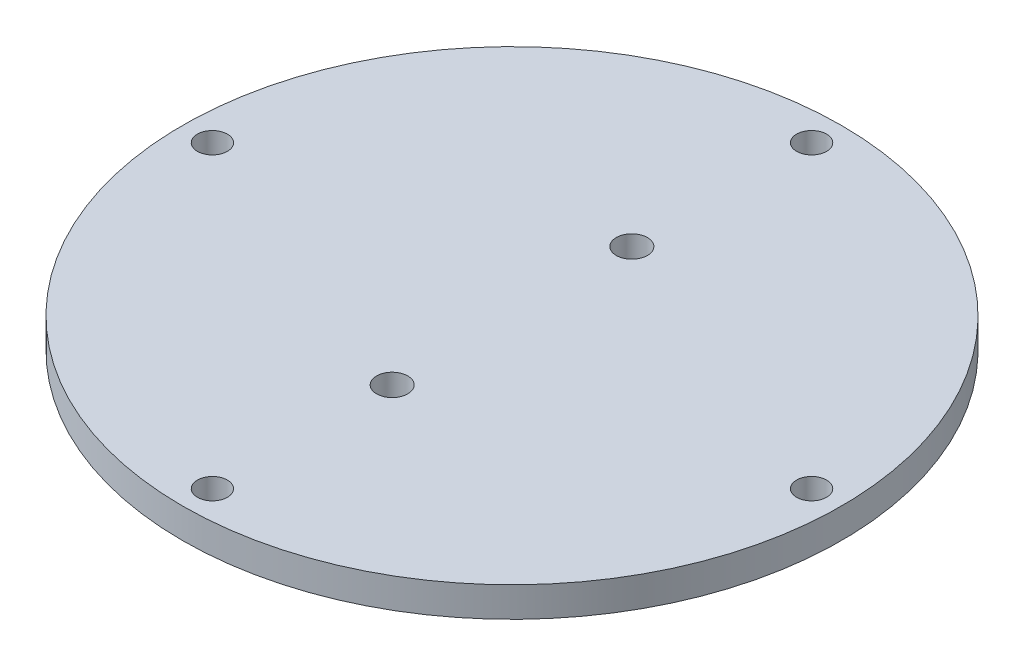
ISO-10303-21;
HEADER;
FILE_DESCRIPTION(('STEP AP214'),'2;1');
FILE_NAME('part.step','',(''),(''),'','','');
FILE_SCHEMA(('AUTOMOTIVE_DESIGN { 1 0 10303 214 1 1 1 1 }'));
ENDSEC;
DATA;
#1=APPLICATION_CONTEXT('core data for automotive mechanical design processes');
#2=APPLICATION_PROTOCOL_DEFINITION('international standard','automotive_design',2000,#1);
#3=PRODUCT_CONTEXT('',#1,'mechanical');
#4=PRODUCT('Part','Part','',(#3));
#5=PRODUCT_RELATED_PRODUCT_CATEGORY('part','',(#4));
#6=PRODUCT_DEFINITION_FORMATION('','',#4);
#7=PRODUCT_DEFINITION_CONTEXT('part definition',#1,'design');
#8=PRODUCT_DEFINITION('design','',#6,#7);
#9=PRODUCT_DEFINITION_SHAPE('','',#8);
#10=(LENGTH_UNIT() NAMED_UNIT(*) SI_UNIT(.MILLI.,.METRE.));
#11=(NAMED_UNIT(*) PLANE_ANGLE_UNIT() SI_UNIT($,.RADIAN.));
#12=(NAMED_UNIT(*) SI_UNIT($,.STERADIAN.) SOLID_ANGLE_UNIT());
#13=UNCERTAINTY_MEASURE_WITH_UNIT(LENGTH_MEASURE(1.E-05),#10,'distance_accuracy_value','');
#14=(GEOMETRIC_REPRESENTATION_CONTEXT(3) GLOBAL_UNCERTAINTY_ASSIGNED_CONTEXT((#13)) GLOBAL_UNIT_ASSIGNED_CONTEXT((#10,
#11,#12)) REPRESENTATION_CONTEXT('',''));
#15=CARTESIAN_POINT('',(0.,0.,0.));
#16=DIRECTION('',(0.,0.,1.));
#17=DIRECTION('',(1.,0.,0.));
#18=AXIS2_PLACEMENT_3D('',#15,#16,#17);
#19=CARTESIAN_POINT('',(0.,5.,0.));
#20=DIRECTION('',(0.,1.,0.));
#21=DIRECTION('',(0.,0.,1.));
#22=AXIS2_PLACEMENT_3D('',#19,#20,#21);
#23=PLANE('',#22);
#24=CARTESIAN_POINT('',(2.82380124105319E-12,5.,50.));
#25=DIRECTION('',(0.,1.,0.));
#26=DIRECTION('',(0.,0.,1.));
#27=AXIS2_PLACEMENT_3D('',#24,#25,#26);
#28=CIRCLE('',#27,2.50000000000304);
#29=CARTESIAN_POINT('',(2.82380124105319E-12,5.,52.500000000003));
#30=VERTEX_POINT('',#29);
#31=EDGE_CURVE('E69',#30,#30,#28,.T.);
#32=ORIENTED_EDGE('',*,*,#31,.F.);
#33=EDGE_LOOP('',(#32));
#34=FACE_BOUND('',#33,.T.);
#35=CARTESIAN_POINT('',(0.,5.,-50.));
#36=DIRECTION('',(0.,1.,0.));
#37=DIRECTION('',(0.,0.,1.));
#38=AXIS2_PLACEMENT_3D('',#35,#36,#37);
#39=CIRCLE('',#38,2.5);
#40=CARTESIAN_POINT('',(0.,5.,-47.5));
#41=VERTEX_POINT('',#40);
#42=EDGE_CURVE('E57',#41,#41,#39,.T.);
#43=ORIENTED_EDGE('',*,*,#42,.F.);
#44=EDGE_LOOP('',(#43));
#45=FACE_BOUND('',#44,.T.);
#46=CARTESIAN_POINT('',(0.,5.,-20.));
#47=DIRECTION('',(0.,1.,0.));
#48=DIRECTION('',(0.,0.,1.));
#49=AXIS2_PLACEMENT_3D('',#46,#47,#48);
#50=CIRCLE('',#49,2.6);
#51=CARTESIAN_POINT('',(0.,5.,-17.4));
#52=VERTEX_POINT('',#51);
#53=EDGE_CURVE('E46',#52,#52,#50,.T.);
#54=ORIENTED_EDGE('',*,*,#53,.F.);
#55=EDGE_LOOP('',(#54));
#56=FACE_BOUND('',#55,.T.);
#57=CARTESIAN_POINT('',(0.,5.,0.));
#58=DIRECTION('',(0.,1.,0.));
#59=DIRECTION('',(0.,0.,1.));
#60=AXIS2_PLACEMENT_3D('',#57,#58,#59);
#61=CIRCLE('',#60,55.);
#62=CARTESIAN_POINT('',(0.,5.,55.));
#63=VERTEX_POINT('',#62);
#64=EDGE_CURVE('E10',#63,#63,#61,.T.);
#65=ORIENTED_EDGE('',*,*,#64,.T.);
#66=EDGE_LOOP('',(#65));
#67=FACE_BOUND('',#66,.T.);
#68=CARTESIAN_POINT('',(0.,5.,20.));
#69=DIRECTION('',(0.,1.,0.));
#70=DIRECTION('',(0.,0.,-1.));
#71=AXIS2_PLACEMENT_3D('',#68,#69,#70);
#72=CIRCLE('',#71,2.6);
#73=CARTESIAN_POINT('',(0.,5.,17.4));
#74=VERTEX_POINT('',#73);
#75=EDGE_CURVE('E51',#74,#74,#72,.T.);
#76=ORIENTED_EDGE('',*,*,#75,.F.);
#77=EDGE_LOOP('',(#76));
#78=FACE_BOUND('',#77,.T.);
#79=CARTESIAN_POINT('',(50.0000000000014,5.,-1.4119006205266E-12));
#80=DIRECTION('',(0.,1.,0.));
#81=DIRECTION('',(0.,0.,1.));
#82=AXIS2_PLACEMENT_3D('',#79,#80,#81);
#83=CIRCLE('',#82,2.50000000000111);
#84=CARTESIAN_POINT('',(50.0000000000014,5.,2.4999999999997));
#85=VERTEX_POINT('',#84);
#86=EDGE_CURVE('E63',#85,#85,#83,.T.);
#87=ORIENTED_EDGE('',*,*,#86,.F.);
#88=EDGE_LOOP('',(#87));
#89=FACE_BOUND('',#88,.T.);
#90=CARTESIAN_POINT('',(-49.9999999999986,5.,1.41802385452233E-12));
#91=DIRECTION('',(0.,1.,0.));
#92=DIRECTION('',(0.,0.,1.));
#93=AXIS2_PLACEMENT_3D('',#90,#91,#92);
#94=CIRCLE('',#93,2.50000000000227);
#95=CARTESIAN_POINT('',(-49.9999999999986,5.,2.50000000000369));
#96=VERTEX_POINT('',#95);
#97=EDGE_CURVE('E75',#96,#96,#94,.T.);
#98=ORIENTED_EDGE('',*,*,#97,.F.);
#99=EDGE_LOOP('',(#98));
#100=FACE_BOUND('',#99,.T.);
#101=ADVANCED_FACE('F35',(#34,#45,#56,#67,#78,#89,#100),#23,.T.);
#102=CARTESIAN_POINT('',(0.,0.,0.));
#103=DIRECTION('',(0.,1.,0.));
#104=DIRECTION('',(0.,0.,1.));
#105=AXIS2_PLACEMENT_3D('',#102,#103,#104);
#106=PLANE('',#105);
#107=CARTESIAN_POINT('',(0.,0.,0.));
#108=DIRECTION('',(0.,1.,0.));
#109=DIRECTION('',(0.,0.,1.));
#110=AXIS2_PLACEMENT_3D('',#107,#108,#109);
#111=CIRCLE('',#110,55.);
#112=CARTESIAN_POINT('',(0.,0.,55.));
#113=VERTEX_POINT('',#112);
#114=EDGE_CURVE('E39',#113,#113,#111,.T.);
#115=ORIENTED_EDGE('',*,*,#114,.F.);
#116=EDGE_LOOP('',(#115));
#117=FACE_BOUND('',#116,.T.);
#118=CARTESIAN_POINT('',(0.,0.,-20.));
#119=DIRECTION('',(0.,1.,0.));
#120=DIRECTION('',(0.,0.,1.));
#121=AXIS2_PLACEMENT_3D('',#118,#119,#120);
#122=CIRCLE('',#121,2.6);
#123=CARTESIAN_POINT('',(0.,0.,-17.4));
#124=VERTEX_POINT('',#123);
#125=EDGE_CURVE('E48',#124,#124,#122,.T.);
#126=ORIENTED_EDGE('',*,*,#125,.T.);
#127=EDGE_LOOP('',(#126));
#128=FACE_BOUND('',#127,.T.);
#129=CARTESIAN_POINT('',(0.,0.,20.));
#130=DIRECTION('',(0.,1.,0.));
#131=DIRECTION('',(0.,0.,-1.));
#132=AXIS2_PLACEMENT_3D('',#129,#130,#131);
#133=CIRCLE('',#132,2.6);
#134=CARTESIAN_POINT('',(0.,0.,17.4));
#135=VERTEX_POINT('',#134);
#136=EDGE_CURVE('E54',#135,#135,#133,.T.);
#137=ORIENTED_EDGE('',*,*,#136,.T.);
#138=EDGE_LOOP('',(#137));
#139=FACE_BOUND('',#138,.T.);
#140=CARTESIAN_POINT('',(0.,0.,-50.));
#141=DIRECTION('',(0.,1.,0.));
#142=DIRECTION('',(0.,0.,1.));
#143=AXIS2_PLACEMENT_3D('',#140,#141,#142);
#144=CIRCLE('',#143,2.5);
#145=CARTESIAN_POINT('',(0.,0.,-47.5));
#146=VERTEX_POINT('',#145);
#147=EDGE_CURVE('E60',#146,#146,#144,.T.);
#148=ORIENTED_EDGE('',*,*,#147,.T.);
#149=EDGE_LOOP('',(#148));
#150=FACE_BOUND('',#149,.T.);
#151=CARTESIAN_POINT('',(50.0000000000014,0.,-1.4119006205266E-12));
#152=DIRECTION('',(0.,1.,0.));
#153=DIRECTION('',(0.,0.,1.));
#154=AXIS2_PLACEMENT_3D('',#151,#152,#153);
#155=CIRCLE('',#154,2.50000000000111);
#156=CARTESIAN_POINT('',(50.0000000000014,0.,2.4999999999997));
#157=VERTEX_POINT('',#156);
#158=EDGE_CURVE('E66',#157,#157,#155,.T.);
#159=ORIENTED_EDGE('',*,*,#158,.T.);
#160=EDGE_LOOP('',(#159));
#161=FACE_BOUND('',#160,.T.);
#162=CARTESIAN_POINT('',(2.82380124105319E-12,0.,50.));
#163=DIRECTION('',(0.,1.,0.));
#164=DIRECTION('',(0.,0.,1.));
#165=AXIS2_PLACEMENT_3D('',#162,#163,#164);
#166=CIRCLE('',#165,2.50000000000304);
#167=CARTESIAN_POINT('',(2.82380124105319E-12,0.,52.500000000003));
#168=VERTEX_POINT('',#167);
#169=EDGE_CURVE('E72',#168,#168,#166,.T.);
#170=ORIENTED_EDGE('',*,*,#169,.T.);
#171=EDGE_LOOP('',(#170));
#172=FACE_BOUND('',#171,.T.);
#173=CARTESIAN_POINT('',(-49.9999999999986,0.,1.41802385452233E-12));
#174=DIRECTION('',(0.,1.,0.));
#175=DIRECTION('',(0.,0.,1.));
#176=AXIS2_PLACEMENT_3D('',#173,#174,#175);
#177=CIRCLE('',#176,2.50000000000227);
#178=CARTESIAN_POINT('',(-49.9999999999986,0.,2.50000000000369));
#179=VERTEX_POINT('',#178);
#180=EDGE_CURVE('E78',#179,#179,#177,.T.);
#181=ORIENTED_EDGE('',*,*,#180,.T.);
#182=EDGE_LOOP('',(#181));
#183=FACE_BOUND('',#182,.T.);
#184=ADVANCED_FACE('F88',(#117,#128,#139,#150,#161,#172,#183),#106,.F.);
#185=CARTESIAN_POINT('',(0.,5.,0.));
#186=DIRECTION('',(0.,-1.,0.));
#187=DIRECTION('',(0.,0.,-1.));
#188=AXIS2_PLACEMENT_3D('',#185,#186,#187);
#189=CYLINDRICAL_SURFACE('',#188,55.);
#190=ORIENTED_EDGE('',*,*,#64,.F.);
#191=EDGE_LOOP('',(#190));
#192=FACE_BOUND('',#191,.T.);
#193=ORIENTED_EDGE('',*,*,#114,.T.);
#194=EDGE_LOOP('',(#193));
#195=FACE_BOUND('',#194,.T.);
#196=ADVANCED_FACE('F37',(#192,#195),#189,.T.);
#197=CARTESIAN_POINT('',(0.,5.,-20.));
#198=DIRECTION('',(0.,-1.,0.));
#199=DIRECTION('',(0.,0.,-1.));
#200=AXIS2_PLACEMENT_3D('',#197,#198,#199);
#201=CYLINDRICAL_SURFACE('',#200,2.6);
#202=ORIENTED_EDGE('',*,*,#53,.T.);
#203=EDGE_LOOP('',(#202));
#204=FACE_BOUND('',#203,.T.);
#205=ORIENTED_EDGE('',*,*,#125,.F.);
#206=EDGE_LOOP('',(#205));
#207=FACE_BOUND('',#206,.T.);
#208=ADVANCED_FACE('F98',(#204,#207),#201,.F.);
#209=CARTESIAN_POINT('',(0.,5.,20.));
#210=DIRECTION('',(0.,-1.,0.));
#211=DIRECTION('',(0.,0.,-1.));
#212=AXIS2_PLACEMENT_3D('',#209,#210,#211);
#213=CYLINDRICAL_SURFACE('',#212,2.6);
#214=ORIENTED_EDGE('',*,*,#75,.T.);
#215=EDGE_LOOP('',(#214));
#216=FACE_BOUND('',#215,.T.);
#217=ORIENTED_EDGE('',*,*,#136,.F.);
#218=EDGE_LOOP('',(#217));
#219=FACE_BOUND('',#218,.T.);
#220=ADVANCED_FACE('F101',(#216,#219),#213,.F.);
#221=CARTESIAN_POINT('',(0.,5.,-50.));
#222=DIRECTION('',(0.,-1.,0.));
#223=DIRECTION('',(0.,0.,-1.));
#224=AXIS2_PLACEMENT_3D('',#221,#222,#223);
#225=CYLINDRICAL_SURFACE('',#224,2.5);
#226=ORIENTED_EDGE('',*,*,#42,.T.);
#227=EDGE_LOOP('',(#226));
#228=FACE_BOUND('',#227,.T.);
#229=ORIENTED_EDGE('',*,*,#147,.F.);
#230=EDGE_LOOP('',(#229));
#231=FACE_BOUND('',#230,.T.);
#232=ADVANCED_FACE('F105',(#228,#231),#225,.F.);
#233=CARTESIAN_POINT('',(50.0000000000014,5.,-1.4119006205266E-12));
#234=DIRECTION('',(0.,-1.,0.));
#235=DIRECTION('',(0.,0.,-1.));
#236=AXIS2_PLACEMENT_3D('',#233,#234,#235);
#237=CYLINDRICAL_SURFACE('',#236,2.50000000000111);
#238=ORIENTED_EDGE('',*,*,#86,.T.);
#239=EDGE_LOOP('',(#238));
#240=FACE_BOUND('',#239,.T.);
#241=ORIENTED_EDGE('',*,*,#158,.F.);
#242=EDGE_LOOP('',(#241));
#243=FACE_BOUND('',#242,.T.);
#244=ADVANCED_FACE('F109',(#240,#243),#237,.F.);
#245=CARTESIAN_POINT('',(2.82380124105319E-12,5.,50.));
#246=DIRECTION('',(0.,-1.,0.));
#247=DIRECTION('',(0.,0.,-1.));
#248=AXIS2_PLACEMENT_3D('',#245,#246,#247);
#249=CYLINDRICAL_SURFACE('',#248,2.50000000000304);
#250=ORIENTED_EDGE('',*,*,#31,.T.);
#251=EDGE_LOOP('',(#250));
#252=FACE_BOUND('',#251,.T.);
#253=ORIENTED_EDGE('',*,*,#169,.F.);
#254=EDGE_LOOP('',(#253));
#255=FACE_BOUND('',#254,.T.);
#256=ADVANCED_FACE('F113',(#252,#255),#249,.F.);
#257=CARTESIAN_POINT('',(-49.9999999999986,5.,1.41802385452233E-12));
#258=DIRECTION('',(0.,-1.,0.));
#259=DIRECTION('',(0.,0.,-1.));
#260=AXIS2_PLACEMENT_3D('',#257,#258,#259);
#261=CYLINDRICAL_SURFACE('',#260,2.50000000000227);
#262=ORIENTED_EDGE('',*,*,#97,.T.);
#263=EDGE_LOOP('',(#262));
#264=FACE_BOUND('',#263,.T.);
#265=ORIENTED_EDGE('',*,*,#180,.F.);
#266=EDGE_LOOP('',(#265));
#267=FACE_BOUND('',#266,.T.);
#268=ADVANCED_FACE('F84',(#264,#267),#261,.F.);
#269=CLOSED_SHELL('',(#101,#184,#196,#208,#220,#232,#244,#256,#268));
#270=MANIFOLD_SOLID_BREP('B2',#269);
#271=ADVANCED_BREP_SHAPE_REPRESENTATION('',(#18,#270),#14);
#272=SHAPE_DEFINITION_REPRESENTATION(#9,#271);
ENDSEC;
END-ISO-10303-21;
